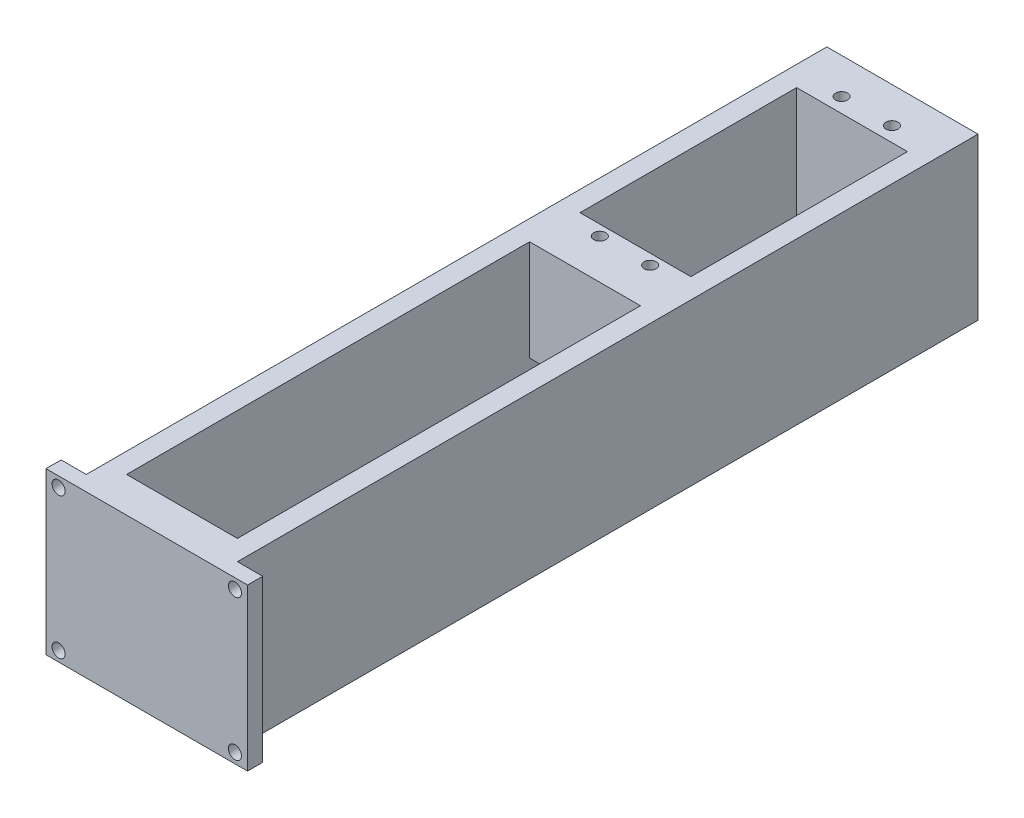
ISO-10303-21;
HEADER;
FILE_DESCRIPTION(('STEP AP214'),'2;1');
FILE_NAME('part.step','',(''),(''),'','','');
FILE_SCHEMA(('AUTOMOTIVE_DESIGN { 1 0 10303 214 1 1 1 1 }'));
ENDSEC;
DATA;
#1=APPLICATION_CONTEXT('core data for automotive mechanical design processes');
#2=APPLICATION_PROTOCOL_DEFINITION('international standard','automotive_design',2000,#1);
#3=PRODUCT_CONTEXT('',#1,'mechanical');
#4=PRODUCT('Part','Part','',(#3));
#5=PRODUCT_RELATED_PRODUCT_CATEGORY('part','',(#4));
#6=PRODUCT_DEFINITION_FORMATION('','',#4);
#7=PRODUCT_DEFINITION_CONTEXT('part definition',#1,'design');
#8=PRODUCT_DEFINITION('design','',#6,#7);
#9=PRODUCT_DEFINITION_SHAPE('','',#8);
#10=(LENGTH_UNIT() NAMED_UNIT(*) SI_UNIT(.MILLI.,.METRE.));
#11=(NAMED_UNIT(*) PLANE_ANGLE_UNIT() SI_UNIT($,.RADIAN.));
#12=(NAMED_UNIT(*) SI_UNIT($,.STERADIAN.) SOLID_ANGLE_UNIT());
#13=UNCERTAINTY_MEASURE_WITH_UNIT(LENGTH_MEASURE(1.E-05),#10,'distance_accuracy_value','');
#14=(GEOMETRIC_REPRESENTATION_CONTEXT(3) GLOBAL_UNCERTAINTY_ASSIGNED_CONTEXT((#13)) GLOBAL_UNIT_ASSIGNED_CONTEXT((#10,
#11,#12)) REPRESENTATION_CONTEXT('',''));
#15=CARTESIAN_POINT('',(0.,0.,0.));
#16=DIRECTION('',(0.,0.,1.));
#17=DIRECTION('',(1.,0.,0.));
#18=AXIS2_PLACEMENT_3D('',#15,#16,#17);
#19=CARTESIAN_POINT('',(0.,40.,0.));
#20=DIRECTION('',(1.,0.,0.));
#21=DIRECTION('',(0.,0.,-1.));
#22=AXIS2_PLACEMENT_3D('',#19,#20,#21);
#23=PLANE('',#22);
#24=DIRECTION('',(0.,-1.,0.));
#25=VECTOR('',#24,1.);
#26=CARTESIAN_POINT('',(0.,40.,-3.));
#27=LINE('',#26,#25);
#28=CARTESIAN_POINT('',(0.,40.,-3.));
#29=VERTEX_POINT('',#28);
#30=CARTESIAN_POINT('',(0.,8.,-3.));
#31=VERTEX_POINT('',#30);
#32=EDGE_CURVE('E256',#29,#31,#27,.T.);
#33=ORIENTED_EDGE('',*,*,#32,.F.);
#34=DIRECTION('',(0.,0.,1.));
#35=VECTOR('',#34,1.);
#36=CARTESIAN_POINT('',(0.,40.,0.));
#37=LINE('',#36,#35);
#38=CARTESIAN_POINT('',(0.,40.,-150.));
#39=VERTEX_POINT('',#38);
#40=EDGE_CURVE('E329',#39,#29,#37,.T.);
#41=ORIENTED_EDGE('',*,*,#40,.F.);
#42=DIRECTION('',(0.,-1.,0.));
#43=VECTOR('',#42,1.);
#44=CARTESIAN_POINT('',(0.,40.,-150.));
#45=LINE('',#44,#43);
#46=CARTESIAN_POINT('',(0.,8.,-150.));
#47=VERTEX_POINT('',#46);
#48=EDGE_CURVE('E338',#39,#47,#45,.T.);
#49=ORIENTED_EDGE('',*,*,#48,.T.);
#50=DIRECTION('',(0.,0.,1.));
#51=VECTOR('',#50,1.);
#52=CARTESIAN_POINT('',(0.,8.,0.));
#53=LINE('',#52,#51);
#54=EDGE_CURVE('E171',#47,#31,#53,.T.);
#55=ORIENTED_EDGE('',*,*,#54,.T.);
#56=EDGE_LOOP('',(#33,#41,#49,#55));
#57=FACE_BOUND('',#56,.T.);
#58=ADVANCED_FACE('F39',(#57),#23,.F.);
#59=CARTESIAN_POINT('',(30.,40.,0.));
#60=DIRECTION('',(-1.,0.,0.));
#61=DIRECTION('',(0.,0.,1.));
#62=AXIS2_PLACEMENT_3D('',#59,#60,#61);
#63=PLANE('',#62);
#64=DIRECTION('',(0.,1.,0.));
#65=VECTOR('',#64,1.);
#66=CARTESIAN_POINT('',(30.,40.,-3.));
#67=LINE('',#66,#65);
#68=CARTESIAN_POINT('',(30.,8.,-3.));
#69=VERTEX_POINT('',#68);
#70=CARTESIAN_POINT('',(30.,40.,-3.));
#71=VERTEX_POINT('',#70);
#72=EDGE_CURVE('E245',#69,#71,#67,.T.);
#73=ORIENTED_EDGE('',*,*,#72,.F.);
#74=DIRECTION('',(0.,0.,-1.));
#75=VECTOR('',#74,1.);
#76=CARTESIAN_POINT('',(30.,8.,-150.));
#77=LINE('',#76,#75);
#78=CARTESIAN_POINT('',(30.,8.,-150.));
#79=VERTEX_POINT('',#78);
#80=EDGE_CURVE('E280',#69,#79,#77,.T.);
#81=ORIENTED_EDGE('',*,*,#80,.T.);
#82=DIRECTION('',(0.,-1.,0.));
#83=VECTOR('',#82,1.);
#84=CARTESIAN_POINT('',(30.,40.,-150.));
#85=LINE('',#84,#83);
#86=CARTESIAN_POINT('',(30.,40.,-150.));
#87=VERTEX_POINT('',#86);
#88=EDGE_CURVE('E341',#87,#79,#85,.T.);
#89=ORIENTED_EDGE('',*,*,#88,.F.);
#90=DIRECTION('',(0.,0.,-1.));
#91=VECTOR('',#90,1.);
#92=CARTESIAN_POINT('',(30.,40.,0.));
#93=LINE('',#92,#91);
#94=EDGE_CURVE('E334',#71,#87,#93,.T.);
#95=ORIENTED_EDGE('',*,*,#94,.F.);
#96=EDGE_LOOP('',(#73,#81,#89,#95));
#97=FACE_BOUND('',#96,.T.);
#98=ADVANCED_FACE('F378',(#97),#63,.F.);
#99=CARTESIAN_POINT('',(0.,40.,0.));
#100=DIRECTION('',(0.,-1.,0.));
#101=DIRECTION('',(0.,0.,-1.));
#102=AXIS2_PLACEMENT_3D('',#99,#100,#101);
#103=PLANE('',#102);
#104=DIRECTION('',(1.,0.,0.));
#105=VECTOR('',#104,1.);
#106=CARTESIAN_POINT('',(4.00000000000001,40.,-7.));
#107=LINE('',#106,#105);
#108=CARTESIAN_POINT('',(4.00000000000001,40.,-7.));
#109=VERTEX_POINT('',#108);
#110=CARTESIAN_POINT('',(26.,40.,-7.00000000000001));
#111=VERTEX_POINT('',#110);
#112=EDGE_CURVE('E188',#109,#111,#107,.T.);
#113=ORIENTED_EDGE('',*,*,#112,.F.);
#114=DIRECTION('',(0.,0.,1.));
#115=VECTOR('',#114,1.);
#116=CARTESIAN_POINT('',(4.,40.,-87.));
#117=LINE('',#116,#115);
#118=CARTESIAN_POINT('',(4.,40.,-87.));
#119=VERTEX_POINT('',#118);
#120=EDGE_CURVE('E53',#119,#109,#117,.T.);
#121=ORIENTED_EDGE('',*,*,#120,.F.);
#122=DIRECTION('',(-1.,0.,0.));
#123=VECTOR('',#122,1.);
#124=CARTESIAN_POINT('',(4.,40.,-87.));
#125=LINE('',#124,#123);
#126=CARTESIAN_POINT('',(26.,40.,-87.));
#127=VERTEX_POINT('',#126);
#128=EDGE_CURVE('E181',#127,#119,#125,.T.);
#129=ORIENTED_EDGE('',*,*,#128,.F.);
#130=DIRECTION('',(0.,0.,-1.));
#131=VECTOR('',#130,1.);
#132=CARTESIAN_POINT('',(26.,40.,-87.));
#133=LINE('',#132,#131);
#134=EDGE_CURVE('E184',#111,#127,#133,.T.);
#135=ORIENTED_EDGE('',*,*,#134,.F.);
#136=EDGE_LOOP('',(#113,#121,#129,#135));
#137=FACE_BOUND('',#136,.T.);
#138=DIRECTION('',(1.,0.,0.));
#139=VECTOR('',#138,1.);
#140=CARTESIAN_POINT('',(0.,40.,0.));
#141=LINE('',#140,#139);
#142=CARTESIAN_POINT('',(-5.,40.,0.));
#143=VERTEX_POINT('',#142);
#144=CARTESIAN_POINT('',(35.,40.,0.));
#145=VERTEX_POINT('',#144);
#146=EDGE_CURVE('E332',#143,#145,#141,.T.);
#147=ORIENTED_EDGE('',*,*,#146,.T.);
#148=DIRECTION('',(0.,0.,1.));
#149=VECTOR('',#148,1.);
#150=CARTESIAN_POINT('',(35.,40.,-3.));
#151=LINE('',#150,#149);
#152=CARTESIAN_POINT('',(35.,40.,-3.));
#153=VERTEX_POINT('',#152);
#154=EDGE_CURVE('E246',#153,#145,#151,.T.);
#155=ORIENTED_EDGE('',*,*,#154,.F.);
#156=DIRECTION('',(-1.,0.,0.));
#157=VECTOR('',#156,1.);
#158=CARTESIAN_POINT('',(-5.,40.,-3.));
#159=LINE('',#158,#157);
#160=EDGE_CURVE('E234',#153,#71,#159,.T.);
#161=ORIENTED_EDGE('',*,*,#160,.T.);
#162=ORIENTED_EDGE('',*,*,#94,.T.);
#163=DIRECTION('',(-1.,0.,0.));
#164=VECTOR('',#163,1.);
#165=CARTESIAN_POINT('',(0.,40.,-150.));
#166=LINE('',#165,#164);
#167=EDGE_CURVE('E336',#87,#39,#166,.T.);
#168=ORIENTED_EDGE('',*,*,#167,.T.);
#169=ORIENTED_EDGE('',*,*,#40,.T.);
#170=CARTESIAN_POINT('',(-5.,40.,-3.));
#171=VERTEX_POINT('',#170);
#172=EDGE_CURVE('E233',#29,#171,#159,.T.);
#173=ORIENTED_EDGE('',*,*,#172,.T.);
#174=DIRECTION('',(0.,0.,1.));
#175=VECTOR('',#174,1.);
#176=CARTESIAN_POINT('',(-5.,40.,-3.));
#177=LINE('',#176,#175);
#178=EDGE_CURVE('E242',#171,#143,#177,.T.);
#179=ORIENTED_EDGE('',*,*,#178,.T.);
#180=EDGE_LOOP('',(#147,#155,#161,#162,#168,#169,#173,#179));
#181=FACE_BOUND('',#180,.T.);
#182=DIRECTION('',(0.,0.,1.));
#183=VECTOR('',#182,1.);
#184=CARTESIAN_POINT('',(4.00000000000001,40.,0.));
#185=LINE('',#184,#183);
#186=CARTESIAN_POINT('',(4.,40.,-140.));
#187=VERTEX_POINT('',#186);
#188=CARTESIAN_POINT('',(4.,40.,-97.));
#189=VERTEX_POINT('',#188);
#190=EDGE_CURVE('E46',#187,#189,#185,.T.);
#191=ORIENTED_EDGE('',*,*,#190,.F.);
#192=DIRECTION('',(-1.,0.,0.));
#193=VECTOR('',#192,1.);
#194=CARTESIAN_POINT('',(0.,40.,-140.));
#195=LINE('',#194,#193);
#196=CARTESIAN_POINT('',(26.,40.,-140.));
#197=VERTEX_POINT('',#196);
#198=EDGE_CURVE('E344',#197,#187,#195,.T.);
#199=ORIENTED_EDGE('',*,*,#198,.F.);
#200=DIRECTION('',(0.,0.,-1.));
#201=VECTOR('',#200,1.);
#202=CARTESIAN_POINT('',(26.,40.,0.));
#203=LINE('',#202,#201);
#204=CARTESIAN_POINT('',(26.,40.,-97.));
#205=VERTEX_POINT('',#204);
#206=EDGE_CURVE('E346',#205,#197,#203,.T.);
#207=ORIENTED_EDGE('',*,*,#206,.F.);
#208=DIRECTION('',(1.,0.,0.));
#209=VECTOR('',#208,1.);
#210=CARTESIAN_POINT('',(0.,40.,-97.));
#211=LINE('',#210,#209);
#212=EDGE_CURVE('E349',#189,#205,#211,.T.);
#213=ORIENTED_EDGE('',*,*,#212,.F.);
#214=EDGE_LOOP('',(#191,#199,#207,#213));
#215=FACE_BOUND('',#214,.T.);
#216=CARTESIAN_POINT('',(10.,40.,-142.924700648295));
#217=DIRECTION('',(0.,1.,0.));
#218=DIRECTION('',(0.,0.,1.));
#219=AXIS2_PLACEMENT_3D('',#216,#217,#218);
#220=CIRCLE('',#219,1.20000000000001);
#221=CARTESIAN_POINT('',(10.,40.,-141.724700648295));
#222=VERTEX_POINT('',#221);
#223=EDGE_CURVE('E268',#222,#222,#220,.T.);
#224=ORIENTED_EDGE('',*,*,#223,.F.);
#225=EDGE_LOOP('',(#224));
#226=FACE_BOUND('',#225,.T.);
#227=CARTESIAN_POINT('',(20.,40.,-94.9247006482949));
#228=DIRECTION('',(0.,1.,0.));
#229=DIRECTION('',(0.,0.,1.));
#230=AXIS2_PLACEMENT_3D('',#227,#228,#229);
#231=CIRCLE('',#230,1.20000000000001);
#232=CARTESIAN_POINT('',(20.,40.,-93.7247006482949));
#233=VERTEX_POINT('',#232);
#234=EDGE_CURVE('E259',#233,#233,#231,.T.);
#235=ORIENTED_EDGE('',*,*,#234,.F.);
#236=EDGE_LOOP('',(#235));
#237=FACE_BOUND('',#236,.T.);
#238=CARTESIAN_POINT('',(10.,40.,-94.9247006482949));
#239=DIRECTION('',(0.,1.,0.));
#240=DIRECTION('',(0.,0.,1.));
#241=AXIS2_PLACEMENT_3D('',#238,#239,#240);
#242=CIRCLE('',#241,1.20000000000001);
#243=CARTESIAN_POINT('',(10.,40.,-93.7247006482949));
#244=VERTEX_POINT('',#243);
#245=EDGE_CURVE('E272',#244,#244,#242,.T.);
#246=ORIENTED_EDGE('',*,*,#245,.F.);
#247=EDGE_LOOP('',(#246));
#248=FACE_BOUND('',#247,.T.);
#249=CARTESIAN_POINT('',(20.,40.,-142.924700648295));
#250=DIRECTION('',(0.,1.,0.));
#251=DIRECTION('',(0.,0.,1.));
#252=AXIS2_PLACEMENT_3D('',#249,#250,#251);
#253=CIRCLE('',#252,1.20000000000001);
#254=CARTESIAN_POINT('',(20.,40.,-141.724700648295));
#255=VERTEX_POINT('',#254);
#256=EDGE_CURVE('E265',#255,#255,#253,.T.);
#257=ORIENTED_EDGE('',*,*,#256,.F.);
#258=EDGE_LOOP('',(#257));
#259=FACE_BOUND('',#258,.T.);
#260=ADVANCED_FACE('F363',(#137,#181,#215,#226,#237,#248,#259),#103,.F.);
#261=CARTESIAN_POINT('',(0.,40.,0.));
#262=DIRECTION('',(0.,0.,-1.));
#263=DIRECTION('',(-1.,0.,0.));
#264=AXIS2_PLACEMENT_3D('',#261,#262,#263);
#265=PLANE('',#264);
#266=CARTESIAN_POINT('',(32.5,10.,0.));
#267=DIRECTION('',(0.,0.,-1.));
#268=DIRECTION('',(-1.,0.,0.));
#269=AXIS2_PLACEMENT_3D('',#266,#267,#268);
#270=CIRCLE('',#269,1.3);
#271=CARTESIAN_POINT('',(31.2,10.,0.));
#272=VERTEX_POINT('',#271);
#273=EDGE_CURVE('E208',#272,#272,#270,.T.);
#274=ORIENTED_EDGE('',*,*,#273,.T.);
#275=EDGE_LOOP('',(#274));
#276=FACE_BOUND('',#275,.T.);
#277=CARTESIAN_POINT('',(-2.49999999999999,38.,0.));
#278=DIRECTION('',(0.,0.,-1.));
#279=DIRECTION('',(-1.,0.,0.));
#280=AXIS2_PLACEMENT_3D('',#277,#278,#279);
#281=CIRCLE('',#280,1.3);
#282=CARTESIAN_POINT('',(-3.79999999999999,38.,0.));
#283=VERTEX_POINT('',#282);
#284=EDGE_CURVE('E201',#283,#283,#281,.T.);
#285=ORIENTED_EDGE('',*,*,#284,.T.);
#286=EDGE_LOOP('',(#285));
#287=FACE_BOUND('',#286,.T.);
#288=CARTESIAN_POINT('',(-2.49999999999999,10.,0.));
#289=DIRECTION('',(0.,0.,-1.));
#290=DIRECTION('',(-1.,0.,0.));
#291=AXIS2_PLACEMENT_3D('',#288,#289,#290);
#292=CIRCLE('',#291,1.3);
#293=CARTESIAN_POINT('',(-3.79999999999999,10.,0.));
#294=VERTEX_POINT('',#293);
#295=EDGE_CURVE('E194',#294,#294,#292,.T.);
#296=ORIENTED_EDGE('',*,*,#295,.T.);
#297=EDGE_LOOP('',(#296));
#298=FACE_BOUND('',#297,.T.);
#299=CARTESIAN_POINT('',(32.5,38.,0.));
#300=DIRECTION('',(0.,0.,-1.));
#301=DIRECTION('',(-1.,0.,0.));
#302=AXIS2_PLACEMENT_3D('',#299,#300,#301);
#303=CIRCLE('',#302,1.3);
#304=CARTESIAN_POINT('',(31.2,38.,0.));
#305=VERTEX_POINT('',#304);
#306=EDGE_CURVE('E216',#305,#305,#303,.T.);
#307=ORIENTED_EDGE('',*,*,#306,.T.);
#308=EDGE_LOOP('',(#307));
#309=FACE_BOUND('',#308,.T.);
#310=ORIENTED_EDGE('',*,*,#146,.F.);
#311=DIRECTION('',(0.,-1.,0.));
#312=VECTOR('',#311,1.);
#313=CARTESIAN_POINT('',(-5.,40.,0.));
#314=LINE('',#313,#312);
#315=CARTESIAN_POINT('',(-5.,8.,0.));
#316=VERTEX_POINT('',#315);
#317=EDGE_CURVE('E219',#143,#316,#314,.T.);
#318=ORIENTED_EDGE('',*,*,#317,.T.);
#319=DIRECTION('',(-1.,0.,0.));
#320=VECTOR('',#319,1.);
#321=CARTESIAN_POINT('',(30.,8.,0.));
#322=LINE('',#321,#320);
#323=CARTESIAN_POINT('',(35.,8.,0.));
#324=VERTEX_POINT('',#323);
#325=EDGE_CURVE('E284',#324,#316,#322,.T.);
#326=ORIENTED_EDGE('',*,*,#325,.F.);
#327=DIRECTION('',(0.,1.,0.));
#328=VECTOR('',#327,1.);
#329=CARTESIAN_POINT('',(35.,40.,0.));
#330=LINE('',#329,#328);
#331=EDGE_CURVE('E226',#324,#145,#330,.T.);
#332=ORIENTED_EDGE('',*,*,#331,.T.);
#333=EDGE_LOOP('',(#310,#318,#326,#332));
#334=FACE_BOUND('',#333,.T.);
#335=ADVANCED_FACE('F377',(#276,#287,#298,#309,#334),#265,.F.);
#336=CARTESIAN_POINT('',(0.,40.,-150.));
#337=DIRECTION('',(0.,0.,1.));
#338=DIRECTION('',(1.,0.,0.));
#339=AXIS2_PLACEMENT_3D('',#336,#337,#338);
#340=PLANE('',#339);
#341=ORIENTED_EDGE('',*,*,#88,.T.);
#342=DIRECTION('',(-1.,0.,0.));
#343=VECTOR('',#342,1.);
#344=CARTESIAN_POINT('',(30.,8.,-150.));
#345=LINE('',#344,#343);
#346=EDGE_CURVE('E285',#79,#47,#345,.T.);
#347=ORIENTED_EDGE('',*,*,#346,.T.);
#348=ORIENTED_EDGE('',*,*,#48,.F.);
#349=ORIENTED_EDGE('',*,*,#167,.F.);
#350=EDGE_LOOP('',(#341,#347,#348,#349));
#351=FACE_BOUND('',#350,.T.);
#352=ADVANCED_FACE('F399',(#351),#340,.F.);
#353=CARTESIAN_POINT('',(4.,40.000012,-140.));
#354=DIRECTION('',(1.,0.,0.));
#355=DIRECTION('',(0.,0.,-1.));
#356=AXIS2_PLACEMENT_3D('',#353,#354,#355);
#357=PLANE('',#356);
#358=DIRECTION('',(0.,0.,1.));
#359=VECTOR('',#358,1.);
#360=CARTESIAN_POINT('',(4.,8.,-140.));
#361=LINE('',#360,#359);
#362=CARTESIAN_POINT('',(4.,8.,-97.));
#363=VERTEX_POINT('',#362);
#364=CARTESIAN_POINT('',(4.00000000000001,8.,-7.));
#365=VERTEX_POINT('',#364);
#366=EDGE_CURVE('E164',#363,#365,#361,.T.);
#367=ORIENTED_EDGE('',*,*,#366,.F.);
#368=DIRECTION('',(0.,-1.,0.));
#369=VECTOR('',#368,1.);
#370=CARTESIAN_POINT('',(4.,20.,-97.));
#371=LINE('',#370,#369);
#372=CARTESIAN_POINT('',(4.,10.,-97.));
#373=VERTEX_POINT('',#372);
#374=EDGE_CURVE('E303',#373,#363,#371,.T.);
#375=ORIENTED_EDGE('',*,*,#374,.F.);
#376=DIRECTION('',(0.,0.,1.));
#377=VECTOR('',#376,1.);
#378=CARTESIAN_POINT('',(4.,10.,-140.));
#379=LINE('',#378,#377);
#380=CARTESIAN_POINT('',(4.,10.,-140.));
#381=VERTEX_POINT('',#380);
#382=EDGE_CURVE('E306',#381,#373,#379,.T.);
#383=ORIENTED_EDGE('',*,*,#382,.F.);
#384=DIRECTION('',(0.,-1.,0.));
#385=VECTOR('',#384,1.);
#386=CARTESIAN_POINT('',(4.,40.000012,-140.));
#387=LINE('',#386,#385);
#388=EDGE_CURVE('E319',#187,#381,#387,.T.);
#389=ORIENTED_EDGE('',*,*,#388,.F.);
#390=ORIENTED_EDGE('',*,*,#190,.T.);
#391=DIRECTION('',(0.,-1.,0.));
#392=VECTOR('',#391,1.);
#393=CARTESIAN_POINT('',(4.,40.000012,-97.));
#394=LINE('',#393,#392);
#395=CARTESIAN_POINT('',(4.,20.,-97.));
#396=VERTEX_POINT('',#395);
#397=EDGE_CURVE('E326',#189,#396,#394,.T.);
#398=ORIENTED_EDGE('',*,*,#397,.T.);
#399=DIRECTION('',(0.,0.,-1.));
#400=VECTOR('',#399,1.);
#401=CARTESIAN_POINT('',(4.,20.,-97.));
#402=LINE('',#401,#400);
#403=CARTESIAN_POINT('',(4.,20.,-87.));
#404=VERTEX_POINT('',#403);
#405=EDGE_CURVE('E292',#404,#396,#402,.T.);
#406=ORIENTED_EDGE('',*,*,#405,.F.);
#407=DIRECTION('',(0.,1.,0.));
#408=VECTOR('',#407,1.);
#409=CARTESIAN_POINT('',(4.,8.,-87.));
#410=LINE('',#409,#408);
#411=EDGE_CURVE('E192',#404,#119,#410,.T.);
#412=ORIENTED_EDGE('',*,*,#411,.T.);
#413=ORIENTED_EDGE('',*,*,#120,.T.);
#414=DIRECTION('',(0.,1.,0.));
#415=VECTOR('',#414,1.);
#416=CARTESIAN_POINT('',(4.00000000000001,8.,-7.));
#417=LINE('',#416,#415);
#418=EDGE_CURVE('E173',#365,#109,#417,.T.);
#419=ORIENTED_EDGE('',*,*,#418,.F.);
#420=EDGE_LOOP('',(#367,#375,#383,#389,#390,#398,#406,#412,#413,#419));
#421=FACE_BOUND('',#420,.T.);
#422=ADVANCED_FACE('F174',(#421),#357,.T.);
#423=CARTESIAN_POINT('',(4.,40.000012,-97.));
#424=DIRECTION('',(0.,0.,-1.));
#425=DIRECTION('',(-1.,0.,0.));
#426=AXIS2_PLACEMENT_3D('',#423,#424,#425);
#427=PLANE('',#426);
#428=DIRECTION('',(1.,0.,0.));
#429=VECTOR('',#428,1.);
#430=CARTESIAN_POINT('',(4.,20.,-97.));
#431=LINE('',#430,#429);
#432=CARTESIAN_POINT('',(26.,20.,-97.));
#433=VERTEX_POINT('',#432);
#434=EDGE_CURVE('E294',#396,#433,#431,.T.);
#435=ORIENTED_EDGE('',*,*,#434,.F.);
#436=ORIENTED_EDGE('',*,*,#397,.F.);
#437=ORIENTED_EDGE('',*,*,#212,.T.);
#438=DIRECTION('',(0.,-1.,0.));
#439=VECTOR('',#438,1.);
#440=CARTESIAN_POINT('',(26.,40.000012,-97.));
#441=LINE('',#440,#439);
#442=EDGE_CURVE('E323',#205,#433,#441,.T.);
#443=ORIENTED_EDGE('',*,*,#442,.T.);
#444=EDGE_LOOP('',(#435,#436,#437,#443));
#445=FACE_BOUND('',#444,.T.);
#446=ADVANCED_FACE('F360',(#445),#427,.T.);
#447=CARTESIAN_POINT('',(26.,40.000012,-140.));
#448=DIRECTION('',(-1.,0.,0.));
#449=DIRECTION('',(0.,0.,1.));
#450=AXIS2_PLACEMENT_3D('',#447,#448,#449);
#451=PLANE('',#450);
#452=DIRECTION('',(0.,0.,-1.));
#453=VECTOR('',#452,1.);
#454=CARTESIAN_POINT('',(26.,8.,-140.));
#455=LINE('',#454,#453);
#456=CARTESIAN_POINT('',(26.,8.,-7.00000000000001));
#457=VERTEX_POINT('',#456);
#458=CARTESIAN_POINT('',(26.,8.,-97.));
#459=VERTEX_POINT('',#458);
#460=EDGE_CURVE('E61',#457,#459,#455,.T.);
#461=ORIENTED_EDGE('',*,*,#460,.F.);
#462=DIRECTION('',(0.,1.,0.));
#463=VECTOR('',#462,1.);
#464=CARTESIAN_POINT('',(26.,8.,-7.00000000000001));
#465=LINE('',#464,#463);
#466=EDGE_CURVE('E178',#457,#111,#465,.T.);
#467=ORIENTED_EDGE('',*,*,#466,.T.);
#468=ORIENTED_EDGE('',*,*,#134,.T.);
#469=DIRECTION('',(0.,1.,0.));
#470=VECTOR('',#469,1.);
#471=CARTESIAN_POINT('',(26.,8.,-87.));
#472=LINE('',#471,#470);
#473=CARTESIAN_POINT('',(26.,20.,-87.));
#474=VERTEX_POINT('',#473);
#475=EDGE_CURVE('E195',#474,#127,#472,.T.);
#476=ORIENTED_EDGE('',*,*,#475,.F.);
#477=DIRECTION('',(0.,0.,1.));
#478=VECTOR('',#477,1.);
#479=CARTESIAN_POINT('',(26.,20.,-97.));
#480=LINE('',#479,#478);
#481=EDGE_CURVE('E297',#433,#474,#480,.T.);
#482=ORIENTED_EDGE('',*,*,#481,.F.);
#483=ORIENTED_EDGE('',*,*,#442,.F.);
#484=ORIENTED_EDGE('',*,*,#206,.T.);
#485=DIRECTION('',(0.,-1.,0.));
#486=VECTOR('',#485,1.);
#487=CARTESIAN_POINT('',(26.,40.000012,-140.));
#488=LINE('',#487,#486);
#489=CARTESIAN_POINT('',(26.,10.,-140.));
#490=VERTEX_POINT('',#489);
#491=EDGE_CURVE('E321',#197,#490,#488,.T.);
#492=ORIENTED_EDGE('',*,*,#491,.T.);
#493=DIRECTION('',(0.,0.,-1.));
#494=VECTOR('',#493,1.);
#495=CARTESIAN_POINT('',(26.,10.,-140.));
#496=LINE('',#495,#494);
#497=CARTESIAN_POINT('',(26.,10.,-97.));
#498=VERTEX_POINT('',#497);
#499=EDGE_CURVE('E313',#498,#490,#496,.T.);
#500=ORIENTED_EDGE('',*,*,#499,.F.);
#501=DIRECTION('',(0.,-1.,0.));
#502=VECTOR('',#501,1.);
#503=CARTESIAN_POINT('',(26.,20.,-97.));
#504=LINE('',#503,#502);
#505=EDGE_CURVE('E304',#498,#459,#504,.T.);
#506=ORIENTED_EDGE('',*,*,#505,.T.);
#507=EDGE_LOOP('',(#461,#467,#468,#476,#482,#483,#484,#492,#500,#506));
#508=FACE_BOUND('',#507,.T.);
#509=ADVANCED_FACE('F365',(#508),#451,.T.);
#510=CARTESIAN_POINT('',(4.,40.000012,-140.));
#511=DIRECTION('',(0.,0.,1.));
#512=DIRECTION('',(1.,0.,0.));
#513=AXIS2_PLACEMENT_3D('',#510,#511,#512);
#514=PLANE('',#513);
#515=ORIENTED_EDGE('',*,*,#198,.T.);
#516=ORIENTED_EDGE('',*,*,#388,.T.);
#517=DIRECTION('',(-1.,0.,0.));
#518=VECTOR('',#517,1.);
#519=CARTESIAN_POINT('',(4.,10.,-140.));
#520=LINE('',#519,#518);
#521=EDGE_CURVE('E316',#490,#381,#520,.T.);
#522=ORIENTED_EDGE('',*,*,#521,.F.);
#523=ORIENTED_EDGE('',*,*,#491,.F.);
#524=EDGE_LOOP('',(#515,#516,#522,#523));
#525=FACE_BOUND('',#524,.T.);
#526=ADVANCED_FACE('F632',(#525),#514,.T.);
#527=CARTESIAN_POINT('',(0.,10.,0.));
#528=DIRECTION('',(0.,1.,0.));
#529=DIRECTION('',(0.,0.,1.));
#530=AXIS2_PLACEMENT_3D('',#527,#528,#529);
#531=PLANE('',#530);
#532=ORIENTED_EDGE('',*,*,#382,.T.);
#533=DIRECTION('',(1.,0.,0.));
#534=VECTOR('',#533,1.);
#535=CARTESIAN_POINT('',(4.,10.,-97.));
#536=LINE('',#535,#534);
#537=EDGE_CURVE('E310',#373,#498,#536,.T.);
#538=ORIENTED_EDGE('',*,*,#537,.T.);
#539=ORIENTED_EDGE('',*,*,#499,.T.);
#540=ORIENTED_EDGE('',*,*,#521,.T.);
#541=EDGE_LOOP('',(#532,#538,#539,#540));
#542=FACE_BOUND('',#541,.T.);
#543=ADVANCED_FACE('F622',(#542),#531,.T.);
#544=CARTESIAN_POINT('',(4.,20.,-97.));
#545=DIRECTION('',(0.,0.,-1.));
#546=DIRECTION('',(-1.,0.,0.));
#547=AXIS2_PLACEMENT_3D('',#544,#545,#546);
#548=PLANE('',#547);
#549=ORIENTED_EDGE('',*,*,#374,.T.);
#550=DIRECTION('',(1.,0.,0.));
#551=VECTOR('',#550,1.);
#552=CARTESIAN_POINT('',(4.,8.,-97.));
#553=LINE('',#552,#551);
#554=EDGE_CURVE('E11',#363,#459,#553,.T.);
#555=ORIENTED_EDGE('',*,*,#554,.T.);
#556=ORIENTED_EDGE('',*,*,#505,.F.);
#557=ORIENTED_EDGE('',*,*,#537,.F.);
#558=EDGE_LOOP('',(#549,#555,#556,#557));
#559=FACE_BOUND('',#558,.T.);
#560=ADVANCED_FACE('F614',(#559),#548,.F.);
#561=CARTESIAN_POINT('',(0.,20.,0.));
#562=DIRECTION('',(0.,1.,0.));
#563=DIRECTION('',(0.,0.,1.));
#564=AXIS2_PLACEMENT_3D('',#561,#562,#563);
#565=PLANE('',#564);
#566=ORIENTED_EDGE('',*,*,#405,.T.);
#567=ORIENTED_EDGE('',*,*,#434,.T.);
#568=ORIENTED_EDGE('',*,*,#481,.T.);
#569=DIRECTION('',(-1.,0.,0.));
#570=VECTOR('',#569,1.);
#571=CARTESIAN_POINT('',(4.,20.,-87.));
#572=LINE('',#571,#570);
#573=EDGE_CURVE('E300',#474,#404,#572,.T.);
#574=ORIENTED_EDGE('',*,*,#573,.T.);
#575=EDGE_LOOP('',(#566,#567,#568,#574));
#576=FACE_BOUND('',#575,.T.);
#577=ADVANCED_FACE('F369',(#576),#565,.F.);
#578=CARTESIAN_POINT('',(30.,8.,-150.));
#579=DIRECTION('',(0.,1.,0.));
#580=DIRECTION('',(0.,0.,1.));
#581=AXIS2_PLACEMENT_3D('',#578,#579,#580);
#582=PLANE('',#581);
#583=ORIENTED_EDGE('',*,*,#366,.T.);
#584=DIRECTION('',(1.,0.,0.));
#585=VECTOR('',#584,1.);
#586=CARTESIAN_POINT('',(4.00000000000001,8.,-7.));
#587=LINE('',#586,#585);
#588=EDGE_CURVE('E168',#365,#457,#587,.T.);
#589=ORIENTED_EDGE('',*,*,#588,.T.);
#590=ORIENTED_EDGE('',*,*,#460,.T.);
#591=ORIENTED_EDGE('',*,*,#554,.F.);
#592=EDGE_LOOP('',(#583,#589,#590,#591));
#593=FACE_BOUND('',#592,.T.);
#594=ORIENTED_EDGE('',*,*,#325,.T.);
#595=DIRECTION('',(0.,0.,1.));
#596=VECTOR('',#595,1.);
#597=CARTESIAN_POINT('',(-5.,8.,-3.));
#598=LINE('',#597,#596);
#599=CARTESIAN_POINT('',(-5.,8.,-3.));
#600=VERTEX_POINT('',#599);
#601=EDGE_CURVE('E237',#600,#316,#598,.T.);
#602=ORIENTED_EDGE('',*,*,#601,.F.);
#603=DIRECTION('',(1.,0.,0.));
#604=VECTOR('',#603,1.);
#605=CARTESIAN_POINT('',(-5.,8.,-3.));
#606=LINE('',#605,#604);
#607=EDGE_CURVE('E227',#600,#31,#606,.T.);
#608=ORIENTED_EDGE('',*,*,#607,.T.);
#609=ORIENTED_EDGE('',*,*,#54,.F.);
#610=ORIENTED_EDGE('',*,*,#346,.F.);
#611=ORIENTED_EDGE('',*,*,#80,.F.);
#612=CARTESIAN_POINT('',(35.,8.,-3.));
#613=VERTEX_POINT('',#612);
#614=EDGE_CURVE('E225',#69,#613,#606,.T.);
#615=ORIENTED_EDGE('',*,*,#614,.T.);
#616=DIRECTION('',(0.,0.,1.));
#617=VECTOR('',#616,1.);
#618=CARTESIAN_POINT('',(35.,8.,-3.));
#619=LINE('',#618,#617);
#620=EDGE_CURVE('E249',#613,#324,#619,.T.);
#621=ORIENTED_EDGE('',*,*,#620,.T.);
#622=EDGE_LOOP('',(#594,#602,#608,#609,#610,#611,#615,#621));
#623=FACE_BOUND('',#622,.T.);
#624=ADVANCED_FACE('F165',(#593,#623),#582,.F.);
#625=CARTESIAN_POINT('',(10.,30.,-142.924700648295));
#626=DIRECTION('',(0.,1.,0.));
#627=DIRECTION('',(0.,0.,1.));
#628=AXIS2_PLACEMENT_3D('',#625,#626,#627);
#629=CYLINDRICAL_SURFACE('',#628,1.20000000000001);
#630=CARTESIAN_POINT('',(10.,30.,-142.924700648295));
#631=DIRECTION('',(0.,1.,0.));
#632=DIRECTION('',(0.,0.,1.));
#633=AXIS2_PLACEMENT_3D('',#630,#631,#632);
#634=CIRCLE('',#633,1.20000000000001);
#635=CARTESIAN_POINT('',(10.,30.,-141.724700648295));
#636=VERTEX_POINT('',#635);
#637=EDGE_CURVE('E277',#636,#636,#634,.T.);
#638=ORIENTED_EDGE('',*,*,#637,.F.);
#639=EDGE_LOOP('',(#638));
#640=FACE_BOUND('',#639,.T.);
#641=ORIENTED_EDGE('',*,*,#223,.T.);
#642=EDGE_LOOP('',(#641));
#643=FACE_BOUND('',#642,.T.);
#644=ADVANCED_FACE('F592',(#640,#643),#629,.F.);
#645=CARTESIAN_POINT('',(10.,30.,-142.924700648295));
#646=DIRECTION('',(0.,1.,0.));
#647=DIRECTION('',(0.,0.,1.));
#648=AXIS2_PLACEMENT_3D('',#645,#646,#647);
#649=PLANE('',#648);
#650=ORIENTED_EDGE('',*,*,#637,.T.);
#651=EDGE_LOOP('',(#650));
#652=FACE_BOUND('',#651,.T.);
#653=ADVANCED_FACE('F583',(#652),#649,.T.);
#654=CARTESIAN_POINT('',(20.,30.,-94.9247006482949));
#655=DIRECTION('',(0.,1.,0.));
#656=DIRECTION('',(0.,0.,1.));
#657=AXIS2_PLACEMENT_3D('',#654,#655,#656);
#658=CYLINDRICAL_SURFACE('',#657,1.20000000000001);
#659=CARTESIAN_POINT('',(20.,30.,-94.9247006482949));
#660=DIRECTION('',(0.,1.,0.));
#661=DIRECTION('',(0.,0.,1.));
#662=AXIS2_PLACEMENT_3D('',#659,#660,#661);
#663=CIRCLE('',#662,1.20000000000001);
#664=CARTESIAN_POINT('',(20.,30.,-93.7247006482949));
#665=VERTEX_POINT('',#664);
#666=EDGE_CURVE('E258',#665,#665,#663,.T.);
#667=ORIENTED_EDGE('',*,*,#666,.F.);
#668=EDGE_LOOP('',(#667));
#669=FACE_BOUND('',#668,.T.);
#670=ORIENTED_EDGE('',*,*,#234,.T.);
#671=EDGE_LOOP('',(#670));
#672=FACE_BOUND('',#671,.T.);
#673=ADVANCED_FACE('F574',(#669,#672),#658,.F.);
#674=CARTESIAN_POINT('',(20.,30.,-94.9247006482949));
#675=DIRECTION('',(0.,1.,0.));
#676=DIRECTION('',(0.,0.,1.));
#677=AXIS2_PLACEMENT_3D('',#674,#675,#676);
#678=PLANE('',#677);
#679=ORIENTED_EDGE('',*,*,#666,.T.);
#680=EDGE_LOOP('',(#679));
#681=FACE_BOUND('',#680,.T.);
#682=ADVANCED_FACE('F565',(#681),#678,.T.);
#683=CARTESIAN_POINT('',(10.,30.,-94.9247006482949));
#684=DIRECTION('',(0.,1.,0.));
#685=DIRECTION('',(0.,0.,1.));
#686=AXIS2_PLACEMENT_3D('',#683,#684,#685);
#687=CYLINDRICAL_SURFACE('',#686,1.20000000000001);
#688=CARTESIAN_POINT('',(10.,30.,-94.9247006482949));
#689=DIRECTION('',(0.,1.,0.));
#690=DIRECTION('',(0.,0.,1.));
#691=AXIS2_PLACEMENT_3D('',#688,#689,#690);
#692=CIRCLE('',#691,1.20000000000001);
#693=CARTESIAN_POINT('',(10.,30.,-93.7247006482949));
#694=VERTEX_POINT('',#693);
#695=EDGE_CURVE('E262',#694,#694,#692,.T.);
#696=ORIENTED_EDGE('',*,*,#695,.F.);
#697=EDGE_LOOP('',(#696));
#698=FACE_BOUND('',#697,.T.);
#699=ORIENTED_EDGE('',*,*,#245,.T.);
#700=EDGE_LOOP('',(#699));
#701=FACE_BOUND('',#700,.T.);
#702=ADVANCED_FACE('F556',(#698,#701),#687,.F.);
#703=CARTESIAN_POINT('',(10.,30.,-94.9247006482949));
#704=DIRECTION('',(0.,1.,0.));
#705=DIRECTION('',(0.,0.,1.));
#706=AXIS2_PLACEMENT_3D('',#703,#704,#705);
#707=PLANE('',#706);
#708=ORIENTED_EDGE('',*,*,#695,.T.);
#709=EDGE_LOOP('',(#708));
#710=FACE_BOUND('',#709,.T.);
#711=ADVANCED_FACE('F547',(#710),#707,.T.);
#712=CARTESIAN_POINT('',(20.,30.,-142.924700648295));
#713=DIRECTION('',(0.,1.,0.));
#714=DIRECTION('',(0.,0.,1.));
#715=AXIS2_PLACEMENT_3D('',#712,#713,#714);
#716=CYLINDRICAL_SURFACE('',#715,1.20000000000001);
#717=CARTESIAN_POINT('',(20.,30.,-142.924700648295));
#718=DIRECTION('',(0.,1.,0.));
#719=DIRECTION('',(0.,0.,1.));
#720=AXIS2_PLACEMENT_3D('',#717,#718,#719);
#721=CIRCLE('',#720,1.20000000000001);
#722=CARTESIAN_POINT('',(20.,30.,-141.724700648295));
#723=VERTEX_POINT('',#722);
#724=EDGE_CURVE('E269',#723,#723,#721,.T.);
#725=ORIENTED_EDGE('',*,*,#724,.F.);
#726=EDGE_LOOP('',(#725));
#727=FACE_BOUND('',#726,.T.);
#728=ORIENTED_EDGE('',*,*,#256,.T.);
#729=EDGE_LOOP('',(#728));
#730=FACE_BOUND('',#729,.T.);
#731=ADVANCED_FACE('F538',(#727,#730),#716,.F.);
#732=CARTESIAN_POINT('',(20.,30.,-142.924700648295));
#733=DIRECTION('',(0.,1.,0.));
#734=DIRECTION('',(0.,0.,1.));
#735=AXIS2_PLACEMENT_3D('',#732,#733,#734);
#736=PLANE('',#735);
#737=ORIENTED_EDGE('',*,*,#724,.T.);
#738=EDGE_LOOP('',(#737));
#739=FACE_BOUND('',#738,.T.);
#740=ADVANCED_FACE('F522',(#739),#736,.T.);
#741=CARTESIAN_POINT('',(35.,40.,-3.));
#742=DIRECTION('',(1.,0.,0.));
#743=DIRECTION('',(0.,1.,0.));
#744=AXIS2_PLACEMENT_3D('',#741,#742,#743);
#745=PLANE('',#744);
#746=ORIENTED_EDGE('',*,*,#331,.F.);
#747=ORIENTED_EDGE('',*,*,#620,.F.);
#748=DIRECTION('',(0.,1.,0.));
#749=VECTOR('',#748,1.);
#750=CARTESIAN_POINT('',(35.,40.,-3.));
#751=LINE('',#750,#749);
#752=EDGE_CURVE('E230',#613,#153,#751,.T.);
#753=ORIENTED_EDGE('',*,*,#752,.T.);
#754=ORIENTED_EDGE('',*,*,#154,.T.);
#755=EDGE_LOOP('',(#746,#747,#753,#754));
#756=FACE_BOUND('',#755,.T.);
#757=ADVANCED_FACE('F385',(#756),#745,.T.);
#758=CARTESIAN_POINT('',(0.,0.,-3.));
#759=DIRECTION('',(0.,0.,1.));
#760=DIRECTION('',(1.,0.,0.));
#761=AXIS2_PLACEMENT_3D('',#758,#759,#760);
#762=PLANE('',#761);
#763=CARTESIAN_POINT('',(32.5,10.,-3.));
#764=DIRECTION('',(0.,0.,-1.));
#765=DIRECTION('',(-1.,0.,0.));
#766=AXIS2_PLACEMENT_3D('',#763,#764,#765);
#767=CIRCLE('',#766,1.3);
#768=CARTESIAN_POINT('',(31.2,10.,-3.));
#769=VERTEX_POINT('',#768);
#770=EDGE_CURVE('E204',#769,#769,#767,.T.);
#771=ORIENTED_EDGE('',*,*,#770,.F.);
#772=EDGE_LOOP('',(#771));
#773=FACE_BOUND('',#772,.T.);
#774=CARTESIAN_POINT('',(32.5,38.,-3.));
#775=DIRECTION('',(0.,0.,-1.));
#776=DIRECTION('',(-1.,0.,0.));
#777=AXIS2_PLACEMENT_3D('',#774,#775,#776);
#778=CIRCLE('',#777,1.3);
#779=CARTESIAN_POINT('',(31.2,38.,-3.));
#780=VERTEX_POINT('',#779);
#781=EDGE_CURVE('E207',#780,#780,#778,.T.);
#782=ORIENTED_EDGE('',*,*,#781,.F.);
#783=EDGE_LOOP('',(#782));
#784=FACE_BOUND('',#783,.T.);
#785=ORIENTED_EDGE('',*,*,#614,.F.);
#786=ORIENTED_EDGE('',*,*,#72,.T.);
#787=ORIENTED_EDGE('',*,*,#160,.F.);
#788=ORIENTED_EDGE('',*,*,#752,.F.);
#789=EDGE_LOOP('',(#785,#786,#787,#788));
#790=FACE_BOUND('',#789,.T.);
#791=ADVANCED_FACE('F392',(#773,#784,#790),#762,.F.);
#792=CARTESIAN_POINT('',(-2.49999999999999,38.,-3.));
#793=DIRECTION('',(0.,0.,-1.));
#794=DIRECTION('',(-1.,0.,0.));
#795=AXIS2_PLACEMENT_3D('',#792,#793,#794);
#796=CIRCLE('',#795,1.3);
#797=CARTESIAN_POINT('',(-3.79999999999999,38.,-3.));
#798=VERTEX_POINT('',#797);
#799=EDGE_CURVE('E211',#798,#798,#796,.T.);
#800=ORIENTED_EDGE('',*,*,#799,.F.);
#801=EDGE_LOOP('',(#800));
#802=FACE_BOUND('',#801,.T.);
#803=CARTESIAN_POINT('',(-2.49999999999999,10.,-3.));
#804=DIRECTION('',(0.,0.,-1.));
#805=DIRECTION('',(-1.,0.,0.));
#806=AXIS2_PLACEMENT_3D('',#803,#804,#805);
#807=CIRCLE('',#806,1.3);
#808=CARTESIAN_POINT('',(-3.79999999999999,10.,-3.));
#809=VERTEX_POINT('',#808);
#810=EDGE_CURVE('E198',#809,#809,#807,.T.);
#811=ORIENTED_EDGE('',*,*,#810,.F.);
#812=EDGE_LOOP('',(#811));
#813=FACE_BOUND('',#812,.T.);
#814=ORIENTED_EDGE('',*,*,#172,.F.);
#815=ORIENTED_EDGE('',*,*,#32,.T.);
#816=ORIENTED_EDGE('',*,*,#607,.F.);
#817=DIRECTION('',(0.,-1.,0.));
#818=VECTOR('',#817,1.);
#819=CARTESIAN_POINT('',(-5.,40.,-3.));
#820=LINE('',#819,#818);
#821=EDGE_CURVE('E222',#171,#600,#820,.T.);
#822=ORIENTED_EDGE('',*,*,#821,.F.);
#823=EDGE_LOOP('',(#814,#815,#816,#822));
#824=FACE_BOUND('',#823,.T.);
#825=ADVANCED_FACE('F408',(#802,#813,#824),#762,.F.);
#826=CARTESIAN_POINT('',(-5.,40.,-3.));
#827=DIRECTION('',(-1.,0.,0.));
#828=DIRECTION('',(0.,-1.,0.));
#829=AXIS2_PLACEMENT_3D('',#826,#827,#828);
#830=PLANE('',#829);
#831=ORIENTED_EDGE('',*,*,#317,.F.);
#832=ORIENTED_EDGE('',*,*,#178,.F.);
#833=ORIENTED_EDGE('',*,*,#821,.T.);
#834=ORIENTED_EDGE('',*,*,#601,.T.);
#835=EDGE_LOOP('',(#831,#832,#833,#834));
#836=FACE_BOUND('',#835,.T.);
#837=ADVANCED_FACE('F406',(#836),#830,.T.);
#838=CARTESIAN_POINT('',(-2.49999999999999,10.,0.));
#839=DIRECTION('',(0.,0.,-1.));
#840=DIRECTION('',(-1.,0.,0.));
#841=AXIS2_PLACEMENT_3D('',#838,#839,#840);
#842=CYLINDRICAL_SURFACE('',#841,1.3);
#843=ORIENTED_EDGE('',*,*,#295,.F.);
#844=EDGE_LOOP('',(#843));
#845=FACE_BOUND('',#844,.T.);
#846=ORIENTED_EDGE('',*,*,#810,.T.);
#847=EDGE_LOOP('',(#846));
#848=FACE_BOUND('',#847,.T.);
#849=ADVANCED_FACE('F417',(#845,#848),#842,.F.);
#850=CARTESIAN_POINT('',(-2.49999999999999,38.,0.));
#851=DIRECTION('',(0.,0.,-1.));
#852=DIRECTION('',(-1.,0.,0.));
#853=AXIS2_PLACEMENT_3D('',#850,#851,#852);
#854=CYLINDRICAL_SURFACE('',#853,1.3);
#855=ORIENTED_EDGE('',*,*,#284,.F.);
#856=EDGE_LOOP('',(#855));
#857=FACE_BOUND('',#856,.T.);
#858=ORIENTED_EDGE('',*,*,#799,.T.);
#859=EDGE_LOOP('',(#858));
#860=FACE_BOUND('',#859,.T.);
#861=ADVANCED_FACE('F451',(#857,#860),#854,.F.);
#862=CARTESIAN_POINT('',(32.5,38.,0.));
#863=DIRECTION('',(0.,0.,-1.));
#864=DIRECTION('',(-1.,0.,0.));
#865=AXIS2_PLACEMENT_3D('',#862,#863,#864);
#866=CYLINDRICAL_SURFACE('',#865,1.3);
#867=ORIENTED_EDGE('',*,*,#306,.F.);
#868=EDGE_LOOP('',(#867));
#869=FACE_BOUND('',#868,.T.);
#870=ORIENTED_EDGE('',*,*,#781,.T.);
#871=EDGE_LOOP('',(#870));
#872=FACE_BOUND('',#871,.T.);
#873=ADVANCED_FACE('F447',(#869,#872),#866,.F.);
#874=CARTESIAN_POINT('',(32.5,10.,0.));
#875=DIRECTION('',(0.,0.,-1.));
#876=DIRECTION('',(-1.,0.,0.));
#877=AXIS2_PLACEMENT_3D('',#874,#875,#876);
#878=CYLINDRICAL_SURFACE('',#877,1.3);
#879=ORIENTED_EDGE('',*,*,#273,.F.);
#880=EDGE_LOOP('',(#879));
#881=FACE_BOUND('',#880,.T.);
#882=ORIENTED_EDGE('',*,*,#770,.T.);
#883=EDGE_LOOP('',(#882));
#884=FACE_BOUND('',#883,.T.);
#885=ADVANCED_FACE('F450',(#881,#884),#878,.F.);
#886=CARTESIAN_POINT('',(4.,8.,-87.));
#887=DIRECTION('',(0.,0.,-1.));
#888=DIRECTION('',(-1.,0.,0.));
#889=AXIS2_PLACEMENT_3D('',#886,#887,#888);
#890=PLANE('',#889);
#891=ORIENTED_EDGE('',*,*,#475,.T.);
#892=ORIENTED_EDGE('',*,*,#128,.T.);
#893=ORIENTED_EDGE('',*,*,#411,.F.);
#894=ORIENTED_EDGE('',*,*,#573,.F.);
#895=EDGE_LOOP('',(#891,#892,#893,#894));
#896=FACE_BOUND('',#895,.T.);
#897=ADVANCED_FACE('F372',(#896),#890,.F.);
#898=CARTESIAN_POINT('',(4.00000000000001,8.,-7.));
#899=DIRECTION('',(0.,0.,1.));
#900=DIRECTION('',(1.,0.,0.));
#901=AXIS2_PLACEMENT_3D('',#898,#899,#900);
#902=PLANE('',#901);
#903=ORIENTED_EDGE('',*,*,#112,.T.);
#904=ORIENTED_EDGE('',*,*,#466,.F.);
#905=ORIENTED_EDGE('',*,*,#588,.F.);
#906=ORIENTED_EDGE('',*,*,#418,.T.);
#907=EDGE_LOOP('',(#903,#904,#905,#906));
#908=FACE_BOUND('',#907,.T.);
#909=ADVANCED_FACE('F180',(#908),#902,.F.);
#910=CLOSED_SHELL('',(#58,#98,#260,#335,#352,#422,#446,#509,#526,#543,#560,#577,#624,#644,#653,
#673,#682,#702,#711,#731,#740,#757,#791,#825,#837,#849,#861,#873,#885,#897,#909));
#911=MANIFOLD_SOLID_BREP('B2',#910);
#912=ADVANCED_BREP_SHAPE_REPRESENTATION('',(#18,#911),#14);
#913=SHAPE_DEFINITION_REPRESENTATION(#9,#912);
ENDSEC;
END-ISO-10303-21;
